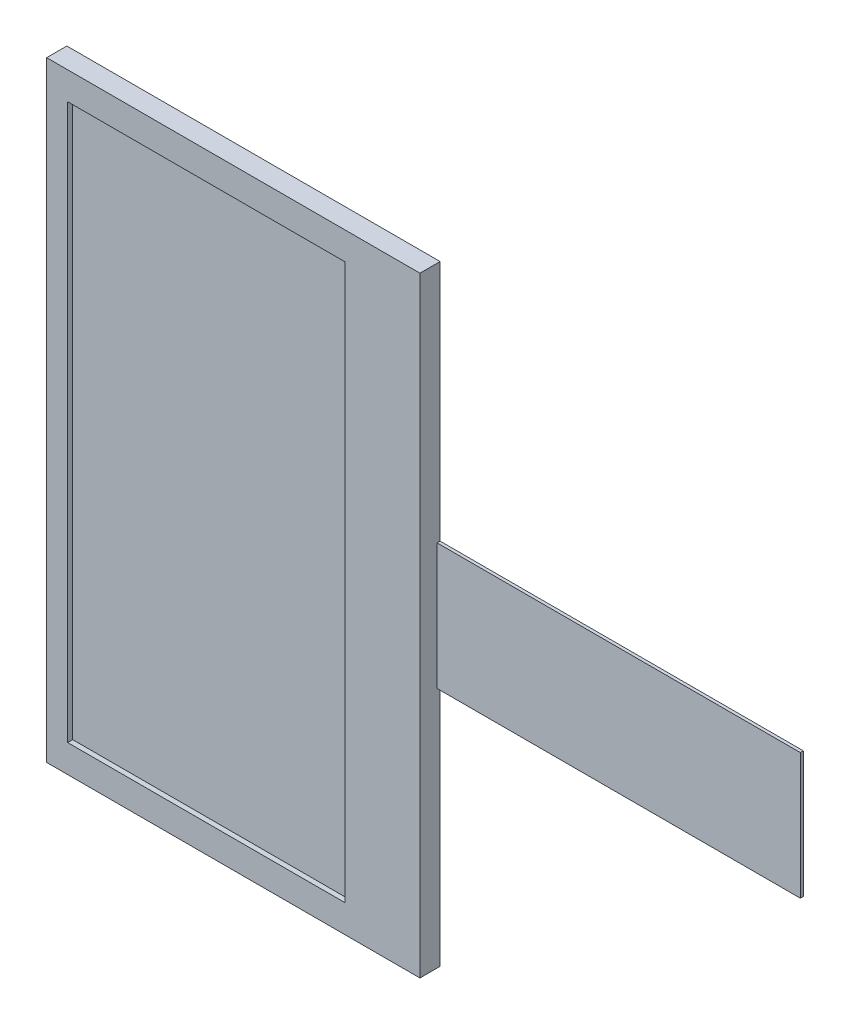
ISO-10303-21;
HEADER;
FILE_DESCRIPTION(('STEP AP214'),'2;1');
FILE_NAME('part.step','',(''),(''),'','','');
FILE_SCHEMA(('AUTOMOTIVE_DESIGN { 1 0 10303 214 1 1 1 1 }'));
ENDSEC;
DATA;
#1=APPLICATION_CONTEXT('core data for automotive mechanical design processes');
#2=APPLICATION_PROTOCOL_DEFINITION('international standard','automotive_design',2000,#1);
#3=PRODUCT_CONTEXT('',#1,'mechanical');
#4=PRODUCT('Part','Part','',(#3));
#5=PRODUCT_RELATED_PRODUCT_CATEGORY('part','',(#4));
#6=PRODUCT_DEFINITION_FORMATION('','',#4);
#7=PRODUCT_DEFINITION_CONTEXT('part definition',#1,'design');
#8=PRODUCT_DEFINITION('design','',#6,#7);
#9=PRODUCT_DEFINITION_SHAPE('','',#8);
#10=(LENGTH_UNIT() NAMED_UNIT(*) SI_UNIT(.MILLI.,.METRE.));
#11=(NAMED_UNIT(*) PLANE_ANGLE_UNIT() SI_UNIT($,.RADIAN.));
#12=(NAMED_UNIT(*) SI_UNIT($,.STERADIAN.) SOLID_ANGLE_UNIT());
#13=UNCERTAINTY_MEASURE_WITH_UNIT(LENGTH_MEASURE(1.E-05),#10,'distance_accuracy_value','');
#14=(GEOMETRIC_REPRESENTATION_CONTEXT(3) GLOBAL_UNCERTAINTY_ASSIGNED_CONTEXT((#13)) GLOBAL_UNIT_ASSIGNED_CONTEXT((#10,
#11,#12)) REPRESENTATION_CONTEXT('',''));
#15=CARTESIAN_POINT('',(0.,0.,0.));
#16=DIRECTION('',(0.,0.,1.));
#17=DIRECTION('',(1.,0.,0.));
#18=AXIS2_PLACEMENT_3D('',#15,#16,#17);
#19=CARTESIAN_POINT('',(57.175,0.,0.3));
#20=DIRECTION('',(1.,0.,0.));
#21=DIRECTION('',(0.,0.,-1.));
#22=AXIS2_PLACEMENT_3D('',#19,#20,#21);
#23=PLANE('',#22);
#24=DIRECTION('',(0.,-1.,0.));
#25=VECTOR('',#24,1.);
#26=CARTESIAN_POINT('',(57.175,0.,0.));
#27=LINE('',#26,#25);
#28=CARTESIAN_POINT('',(57.175,6.245,0.));
#29=VERTEX_POINT('',#28);
#30=CARTESIAN_POINT('',(57.175,-6.255,0.));
#31=VERTEX_POINT('',#30);
#32=EDGE_CURVE('E111',#29,#31,#27,.T.);
#33=ORIENTED_EDGE('',*,*,#32,.F.);
#34=DIRECTION('',(0.,0.,-1.));
#35=VECTOR('',#34,1.);
#36=CARTESIAN_POINT('',(57.175,6.245,0.3));
#37=LINE('',#36,#35);
#38=CARTESIAN_POINT('',(57.175,6.245,0.3));
#39=VERTEX_POINT('',#38);
#40=EDGE_CURVE('E12',#39,#29,#37,.T.);
#41=ORIENTED_EDGE('',*,*,#40,.F.);
#42=DIRECTION('',(0.,-1.,0.));
#43=VECTOR('',#42,1.);
#44=CARTESIAN_POINT('',(57.175,0.,0.3));
#45=LINE('',#44,#43);
#46=CARTESIAN_POINT('',(57.175,-6.255,0.3));
#47=VERTEX_POINT('',#46);
#48=EDGE_CURVE('E105',#39,#47,#45,.T.);
#49=ORIENTED_EDGE('',*,*,#48,.T.);
#50=DIRECTION('',(0.,0.,-1.));
#51=VECTOR('',#50,1.);
#52=CARTESIAN_POINT('',(57.175,-6.255,0.3));
#53=LINE('',#52,#51);
#54=EDGE_CURVE('E86',#47,#31,#53,.T.);
#55=ORIENTED_EDGE('',*,*,#54,.T.);
#56=EDGE_LOOP('',(#33,#41,#49,#55));
#57=FACE_BOUND('',#56,.T.);
#58=ADVANCED_FACE('F48',(#57),#23,.T.);
#59=CARTESIAN_POINT('',(0.,6.245,0.3));
#60=DIRECTION('',(0.,1.,0.));
#61=DIRECTION('',(0.,0.,1.));
#62=AXIS2_PLACEMENT_3D('',#59,#60,#61);
#63=PLANE('',#62);
#64=DIRECTION('',(1.,0.,0.));
#65=VECTOR('',#64,1.);
#66=CARTESIAN_POINT('',(0.,6.245,0.));
#67=LINE('',#66,#65);
#68=CARTESIAN_POINT('',(21.175,6.245,0.));
#69=VERTEX_POINT('',#68);
#70=EDGE_CURVE('E99',#69,#29,#67,.T.);
#71=ORIENTED_EDGE('',*,*,#70,.F.);
#72=DIRECTION('',(0.,0.,-1.));
#73=VECTOR('',#72,1.);
#74=CARTESIAN_POINT('',(21.175,6.245,0.3));
#75=LINE('',#74,#73);
#76=CARTESIAN_POINT('',(21.175,6.245,0.3));
#77=VERTEX_POINT('',#76);
#78=EDGE_CURVE('E56',#77,#69,#75,.T.);
#79=ORIENTED_EDGE('',*,*,#78,.F.);
#80=DIRECTION('',(1.,0.,0.));
#81=VECTOR('',#80,1.);
#82=CARTESIAN_POINT('',(0.,6.245,0.3));
#83=LINE('',#82,#81);
#84=EDGE_CURVE('E97',#77,#39,#83,.T.);
#85=ORIENTED_EDGE('',*,*,#84,.T.);
#86=ORIENTED_EDGE('',*,*,#40,.T.);
#87=EDGE_LOOP('',(#71,#79,#85,#86));
#88=FACE_BOUND('',#87,.T.);
#89=ADVANCED_FACE('F95',(#88),#63,.T.);
#90=CARTESIAN_POINT('',(21.175,0.,0.3));
#91=DIRECTION('',(1.,0.,0.));
#92=DIRECTION('',(0.,0.,-1.));
#93=AXIS2_PLACEMENT_3D('',#90,#91,#92);
#94=PLANE('',#93);
#95=DIRECTION('',(0.,-1.,0.));
#96=VECTOR('',#95,1.);
#97=CARTESIAN_POINT('',(21.175,0.,0.));
#98=LINE('',#97,#96);
#99=CARTESIAN_POINT('',(21.175,-6.255,0.));
#100=VERTEX_POINT('',#99);
#101=EDGE_CURVE('E79',#69,#100,#98,.T.);
#102=ORIENTED_EDGE('',*,*,#101,.T.);
#103=DIRECTION('',(0.,0.,-1.));
#104=VECTOR('',#103,1.);
#105=CARTESIAN_POINT('',(21.175,-6.255,0.3));
#106=LINE('',#105,#104);
#107=CARTESIAN_POINT('',(21.175,-6.255,0.3));
#108=VERTEX_POINT('',#107);
#109=EDGE_CURVE('E100',#108,#100,#106,.T.);
#110=ORIENTED_EDGE('',*,*,#109,.F.);
#111=DIRECTION('',(0.,-1.,0.));
#112=VECTOR('',#111,1.);
#113=CARTESIAN_POINT('',(21.175,0.,0.3));
#114=LINE('',#113,#112);
#115=EDGE_CURVE('E101',#77,#108,#114,.T.);
#116=ORIENTED_EDGE('',*,*,#115,.F.);
#117=ORIENTED_EDGE('',*,*,#78,.T.);
#118=EDGE_LOOP('',(#102,#110,#116,#117));
#119=FACE_BOUND('',#118,.T.);
#120=ADVANCED_FACE('F102',(#119),#94,.F.);
#121=CARTESIAN_POINT('',(0.,-6.255,0.3));
#122=DIRECTION('',(0.,1.,0.));
#123=DIRECTION('',(0.,0.,1.));
#124=AXIS2_PLACEMENT_3D('',#121,#122,#123);
#125=PLANE('',#124);
#126=DIRECTION('',(1.,0.,0.));
#127=VECTOR('',#126,1.);
#128=CARTESIAN_POINT('',(0.,-6.255,0.));
#129=LINE('',#128,#127);
#130=EDGE_CURVE('E107',#100,#31,#129,.T.);
#131=ORIENTED_EDGE('',*,*,#130,.T.);
#132=ORIENTED_EDGE('',*,*,#54,.F.);
#133=DIRECTION('',(1.,0.,0.));
#134=VECTOR('',#133,1.);
#135=CARTESIAN_POINT('',(0.,-6.255,0.3));
#136=LINE('',#135,#134);
#137=EDGE_CURVE('E64',#108,#47,#136,.T.);
#138=ORIENTED_EDGE('',*,*,#137,.F.);
#139=ORIENTED_EDGE('',*,*,#109,.T.);
#140=EDGE_LOOP('',(#131,#132,#138,#139));
#141=FACE_BOUND('',#140,.T.);
#142=ADVANCED_FACE('F120',(#141),#125,.F.);
#143=CARTESIAN_POINT('',(0.,0.,0.3));
#144=DIRECTION('',(0.,0.,1.));
#145=DIRECTION('',(1.,0.,0.));
#146=AXIS2_PLACEMENT_3D('',#143,#144,#145);
#147=PLANE('',#146);
#148=ORIENTED_EDGE('',*,*,#48,.F.);
#149=ORIENTED_EDGE('',*,*,#84,.F.);
#150=ORIENTED_EDGE('',*,*,#115,.T.);
#151=ORIENTED_EDGE('',*,*,#137,.T.);
#152=EDGE_LOOP('',(#148,#149,#150,#151));
#153=FACE_BOUND('',#152,.T.);
#154=ADVANCED_FACE('F104',(#153),#147,.T.);
#155=CARTESIAN_POINT('',(0.,0.,0.));
#156=DIRECTION('',(0.,0.,1.));
#157=DIRECTION('',(1.,0.,0.));
#158=AXIS2_PLACEMENT_3D('',#155,#156,#157);
#159=PLANE('',#158);
#160=ORIENTED_EDGE('',*,*,#32,.T.);
#161=ORIENTED_EDGE('',*,*,#130,.F.);
#162=ORIENTED_EDGE('',*,*,#101,.F.);
#163=ORIENTED_EDGE('',*,*,#70,.T.);
#164=EDGE_LOOP('',(#160,#161,#162,#163));
#165=FACE_BOUND('',#164,.T.);
#166=ADVANCED_FACE('F122',(#165),#159,.F.);
#167=CLOSED_SHELL('',(#58,#89,#120,#142,#154,#166));
#168=MANIFOLD_SOLID_BREP('B2',#167);
#169=CARTESIAN_POINT('',(0.,30.245,2.));
#170=DIRECTION('',(0.,-1.,0.));
#171=DIRECTION('',(0.,0.,-1.));
#172=AXIS2_PLACEMENT_3D('',#169,#170,#171);
#173=PLANE('',#172);
#174=DIRECTION('',(-1.,0.,0.));
#175=VECTOR('',#174,1.);
#176=CARTESIAN_POINT('',(0.,30.245,0.));
#177=LINE('',#176,#175);
#178=CARTESIAN_POINT('',(21.175,30.245,0.));
#179=VERTEX_POINT('',#178);
#180=CARTESIAN_POINT('',(-15.825,30.245,0.));
#181=VERTEX_POINT('',#180);
#182=EDGE_CURVE('E288',#179,#181,#177,.T.);
#183=ORIENTED_EDGE('',*,*,#182,.T.);
#184=DIRECTION('',(0.,0.,-1.));
#185=VECTOR('',#184,1.);
#186=CARTESIAN_POINT('',(-15.825,30.245,2.));
#187=LINE('',#186,#185);
#188=CARTESIAN_POINT('',(-15.825,30.245,2.));
#189=VERTEX_POINT('',#188);
#190=EDGE_CURVE('E46',#189,#181,#187,.T.);
#191=ORIENTED_EDGE('',*,*,#190,.F.);
#192=DIRECTION('',(-1.,0.,0.));
#193=VECTOR('',#192,1.);
#194=CARTESIAN_POINT('',(0.,30.245,2.));
#195=LINE('',#194,#193);
#196=CARTESIAN_POINT('',(21.175,30.245,2.));
#197=VERTEX_POINT('',#196);
#198=EDGE_CURVE('E260',#197,#189,#195,.T.);
#199=ORIENTED_EDGE('',*,*,#198,.F.);
#200=DIRECTION('',(0.,0.,-1.));
#201=VECTOR('',#200,1.);
#202=CARTESIAN_POINT('',(21.175,30.245,2.));
#203=LINE('',#202,#201);
#204=EDGE_CURVE('E200',#197,#179,#203,.T.);
#205=ORIENTED_EDGE('',*,*,#204,.T.);
#206=EDGE_LOOP('',(#183,#191,#199,#205));
#207=FACE_BOUND('',#206,.T.);
#208=ADVANCED_FACE('F181',(#207),#173,.F.);
#209=CARTESIAN_POINT('',(-15.825,0.,2.));
#210=DIRECTION('',(1.,0.,0.));
#211=DIRECTION('',(0.,0.,-1.));
#212=AXIS2_PLACEMENT_3D('',#209,#210,#211);
#213=PLANE('',#212);
#214=DIRECTION('',(0.,-1.,0.));
#215=VECTOR('',#214,1.);
#216=CARTESIAN_POINT('',(-15.825,0.,0.));
#217=LINE('',#216,#215);
#218=CARTESIAN_POINT('',(-15.825,-30.255,0.));
#219=VERTEX_POINT('',#218);
#220=EDGE_CURVE('E266',#181,#219,#217,.T.);
#221=ORIENTED_EDGE('',*,*,#220,.T.);
#222=DIRECTION('',(0.,0.,-1.));
#223=VECTOR('',#222,1.);
#224=CARTESIAN_POINT('',(-15.825,-30.255,2.));
#225=LINE('',#224,#223);
#226=CARTESIAN_POINT('',(-15.825,-30.255,2.));
#227=VERTEX_POINT('',#226);
#228=EDGE_CURVE('E191',#227,#219,#225,.T.);
#229=ORIENTED_EDGE('',*,*,#228,.F.);
#230=DIRECTION('',(0.,-1.,0.));
#231=VECTOR('',#230,1.);
#232=CARTESIAN_POINT('',(-15.825,0.,2.));
#233=LINE('',#232,#231);
#234=EDGE_CURVE('E254',#189,#227,#233,.T.);
#235=ORIENTED_EDGE('',*,*,#234,.F.);
#236=ORIENTED_EDGE('',*,*,#190,.T.);
#237=EDGE_LOOP('',(#221,#229,#235,#236));
#238=FACE_BOUND('',#237,.T.);
#239=ADVANCED_FACE('F265',(#238),#213,.F.);
#240=CARTESIAN_POINT('',(0.,-30.255,2.));
#241=DIRECTION('',(0.,-1.,0.));
#242=DIRECTION('',(0.,0.,-1.));
#243=AXIS2_PLACEMENT_3D('',#240,#241,#242);
#244=PLANE('',#243);
#245=DIRECTION('',(-1.,0.,0.));
#246=VECTOR('',#245,1.);
#247=CARTESIAN_POINT('',(0.,-30.255,0.));
#248=LINE('',#247,#246);
#249=CARTESIAN_POINT('',(21.175,-30.255,0.));
#250=VERTEX_POINT('',#249);
#251=EDGE_CURVE('E291',#250,#219,#248,.T.);
#252=ORIENTED_EDGE('',*,*,#251,.F.);
#253=DIRECTION('',(0.,0.,-1.));
#254=VECTOR('',#253,1.);
#255=CARTESIAN_POINT('',(21.175,-30.255,2.));
#256=LINE('',#255,#254);
#257=CARTESIAN_POINT('',(21.175,-30.255,2.));
#258=VERTEX_POINT('',#257);
#259=EDGE_CURVE('E226',#258,#250,#256,.T.);
#260=ORIENTED_EDGE('',*,*,#259,.F.);
#261=DIRECTION('',(-1.,0.,0.));
#262=VECTOR('',#261,1.);
#263=CARTESIAN_POINT('',(0.,-30.255,2.));
#264=LINE('',#263,#262);
#265=EDGE_CURVE('E259',#258,#227,#264,.T.);
#266=ORIENTED_EDGE('',*,*,#265,.T.);
#267=ORIENTED_EDGE('',*,*,#228,.T.);
#268=EDGE_LOOP('',(#252,#260,#266,#267));
#269=FACE_BOUND('',#268,.T.);
#270=ADVANCED_FACE('F270',(#269),#244,.T.);
#271=CARTESIAN_POINT('',(-13.745,0.,2.));
#272=DIRECTION('',(1.,0.,0.));
#273=DIRECTION('',(0.,0.,-1.));
#274=AXIS2_PLACEMENT_3D('',#271,#272,#273);
#275=PLANE('',#274);
#276=DIRECTION('',(0.,-1.,0.));
#277=VECTOR('',#276,1.);
#278=CARTESIAN_POINT('',(-13.745,0.,0.));
#279=LINE('',#278,#277);
#280=CARTESIAN_POINT('',(-13.745,27.505,0.));
#281=VERTEX_POINT('',#280);
#282=CARTESIAN_POINT('',(-13.745,-27.505,0.));
#283=VERTEX_POINT('',#282);
#284=EDGE_CURVE('E277',#281,#283,#279,.T.);
#285=ORIENTED_EDGE('',*,*,#284,.F.);
#286=DIRECTION('',(0.,0.,-1.));
#287=VECTOR('',#286,1.);
#288=CARTESIAN_POINT('',(-13.745,27.505,2.));
#289=LINE('',#288,#287);
#290=CARTESIAN_POINT('',(-13.745,27.505,2.));
#291=VERTEX_POINT('',#290);
#292=EDGE_CURVE('E185',#291,#281,#289,.T.);
#293=ORIENTED_EDGE('',*,*,#292,.F.);
#294=DIRECTION('',(0.,-1.,0.));
#295=VECTOR('',#294,1.);
#296=CARTESIAN_POINT('',(-13.745,0.,2.));
#297=LINE('',#296,#295);
#298=CARTESIAN_POINT('',(-13.745,-27.505,2.));
#299=VERTEX_POINT('',#298);
#300=EDGE_CURVE('E296',#291,#299,#297,.T.);
#301=ORIENTED_EDGE('',*,*,#300,.T.);
#302=DIRECTION('',(0.,0.,-1.));
#303=VECTOR('',#302,1.);
#304=CARTESIAN_POINT('',(-13.745,-27.505,2.));
#305=LINE('',#304,#303);
#306=EDGE_CURVE('E273',#299,#283,#305,.T.);
#307=ORIENTED_EDGE('',*,*,#306,.T.);
#308=EDGE_LOOP('',(#285,#293,#301,#307));
#309=FACE_BOUND('',#308,.T.);
#310=ADVANCED_FACE('F183',(#309),#275,.T.);
#311=CARTESIAN_POINT('',(0.,27.505,2.));
#312=DIRECTION('',(0.,-1.,0.));
#313=DIRECTION('',(0.,0.,-1.));
#314=AXIS2_PLACEMENT_3D('',#311,#312,#313);
#315=PLANE('',#314);
#316=DIRECTION('',(-1.,0.,0.));
#317=VECTOR('',#316,1.);
#318=CARTESIAN_POINT('',(0.,27.505,0.));
#319=LINE('',#318,#317);
#320=CARTESIAN_POINT('',(13.745,27.505,0.));
#321=VERTEX_POINT('',#320);
#322=EDGE_CURVE('E280',#321,#281,#319,.T.);
#323=ORIENTED_EDGE('',*,*,#322,.F.);
#324=DIRECTION('',(0.,0.,-1.));
#325=VECTOR('',#324,1.);
#326=CARTESIAN_POINT('',(13.745,27.505,2.));
#327=LINE('',#326,#325);
#328=CARTESIAN_POINT('',(13.745,27.505,2.));
#329=VERTEX_POINT('',#328);
#330=EDGE_CURVE('E302',#329,#321,#327,.T.);
#331=ORIENTED_EDGE('',*,*,#330,.F.);
#332=DIRECTION('',(-1.,0.,0.));
#333=VECTOR('',#332,1.);
#334=CARTESIAN_POINT('',(0.,27.505,2.));
#335=LINE('',#334,#333);
#336=EDGE_CURVE('E311',#329,#291,#335,.T.);
#337=ORIENTED_EDGE('',*,*,#336,.T.);
#338=ORIENTED_EDGE('',*,*,#292,.T.);
#339=EDGE_LOOP('',(#323,#331,#337,#338));
#340=FACE_BOUND('',#339,.T.);
#341=ADVANCED_FACE('F309',(#340),#315,.T.);
#342=CARTESIAN_POINT('',(13.745,0.,2.));
#343=DIRECTION('',(1.,0.,0.));
#344=DIRECTION('',(0.,0.,-1.));
#345=AXIS2_PLACEMENT_3D('',#342,#343,#344);
#346=PLANE('',#345);
#347=DIRECTION('',(0.,-1.,0.));
#348=VECTOR('',#347,1.);
#349=CARTESIAN_POINT('',(13.745,0.,0.));
#350=LINE('',#349,#348);
#351=CARTESIAN_POINT('',(13.745,-27.505,0.));
#352=VERTEX_POINT('',#351);
#353=EDGE_CURVE('E283',#321,#352,#350,.T.);
#354=ORIENTED_EDGE('',*,*,#353,.T.);
#355=DIRECTION('',(0.,0.,-1.));
#356=VECTOR('',#355,1.);
#357=CARTESIAN_POINT('',(13.745,-27.505,2.));
#358=LINE('',#357,#356);
#359=CARTESIAN_POINT('',(13.745,-27.505,2.));
#360=VERTEX_POINT('',#359);
#361=EDGE_CURVE('E300',#360,#352,#358,.T.);
#362=ORIENTED_EDGE('',*,*,#361,.F.);
#363=DIRECTION('',(0.,-1.,0.));
#364=VECTOR('',#363,1.);
#365=CARTESIAN_POINT('',(13.745,0.,2.));
#366=LINE('',#365,#364);
#367=EDGE_CURVE('E324',#329,#360,#366,.T.);
#368=ORIENTED_EDGE('',*,*,#367,.F.);
#369=ORIENTED_EDGE('',*,*,#330,.T.);
#370=EDGE_LOOP('',(#354,#362,#368,#369));
#371=FACE_BOUND('',#370,.T.);
#372=ADVANCED_FACE('F318',(#371),#346,.F.);
#373=CARTESIAN_POINT('',(0.,-27.505,2.));
#374=DIRECTION('',(0.,-1.,0.));
#375=DIRECTION('',(0.,0.,-1.));
#376=AXIS2_PLACEMENT_3D('',#373,#374,#375);
#377=PLANE('',#376);
#378=DIRECTION('',(-1.,0.,0.));
#379=VECTOR('',#378,1.);
#380=CARTESIAN_POINT('',(0.,-27.505,0.));
#381=LINE('',#380,#379);
#382=EDGE_CURVE('E285',#352,#283,#381,.T.);
#383=ORIENTED_EDGE('',*,*,#382,.T.);
#384=ORIENTED_EDGE('',*,*,#306,.F.);
#385=DIRECTION('',(-1.,0.,0.));
#386=VECTOR('',#385,1.);
#387=CARTESIAN_POINT('',(0.,-27.505,2.));
#388=LINE('',#387,#386);
#389=EDGE_CURVE('E322',#360,#299,#388,.T.);
#390=ORIENTED_EDGE('',*,*,#389,.F.);
#391=ORIENTED_EDGE('',*,*,#361,.T.);
#392=EDGE_LOOP('',(#383,#384,#390,#391));
#393=FACE_BOUND('',#392,.T.);
#394=ADVANCED_FACE('F321',(#393),#377,.F.);
#395=CARTESIAN_POINT('',(21.175,0.,2.));
#396=DIRECTION('',(1.,0.,0.));
#397=DIRECTION('',(0.,0.,-1.));
#398=AXIS2_PLACEMENT_3D('',#395,#396,#397);
#399=PLANE('',#398);
#400=DIRECTION('',(0.,-1.,0.));
#401=VECTOR('',#400,1.);
#402=CARTESIAN_POINT('',(21.175,0.,0.));
#403=LINE('',#402,#401);
#404=EDGE_CURVE('E293',#179,#250,#403,.T.);
#405=ORIENTED_EDGE('',*,*,#404,.F.);
#406=ORIENTED_EDGE('',*,*,#204,.F.);
#407=DIRECTION('',(0.,-1.,0.));
#408=VECTOR('',#407,1.);
#409=CARTESIAN_POINT('',(21.175,0.,2.));
#410=LINE('',#409,#408);
#411=EDGE_CURVE('E271',#197,#258,#410,.T.);
#412=ORIENTED_EDGE('',*,*,#411,.T.);
#413=ORIENTED_EDGE('',*,*,#259,.T.);
#414=EDGE_LOOP('',(#405,#406,#412,#413));
#415=FACE_BOUND('',#414,.T.);
#416=ADVANCED_FACE('F330',(#415),#399,.T.);
#417=CARTESIAN_POINT('',(0.,0.,2.));
#418=DIRECTION('',(0.,0.,1.));
#419=DIRECTION('',(1.,0.,0.));
#420=AXIS2_PLACEMENT_3D('',#417,#418,#419);
#421=PLANE('',#420);
#422=ORIENTED_EDGE('',*,*,#300,.F.);
#423=ORIENTED_EDGE('',*,*,#336,.F.);
#424=ORIENTED_EDGE('',*,*,#367,.T.);
#425=ORIENTED_EDGE('',*,*,#389,.T.);
#426=EDGE_LOOP('',(#422,#423,#424,#425));
#427=FACE_BOUND('',#426,.T.);
#428=ORIENTED_EDGE('',*,*,#198,.T.);
#429=ORIENTED_EDGE('',*,*,#234,.T.);
#430=ORIENTED_EDGE('',*,*,#265,.F.);
#431=ORIENTED_EDGE('',*,*,#411,.F.);
#432=EDGE_LOOP('',(#428,#429,#430,#431));
#433=FACE_BOUND('',#432,.T.);
#434=ADVANCED_FACE('F256',(#427,#433),#421,.T.);
#435=CARTESIAN_POINT('',(0.,0.,0.));
#436=DIRECTION('',(0.,0.,1.));
#437=DIRECTION('',(1.,0.,0.));
#438=AXIS2_PLACEMENT_3D('',#435,#436,#437);
#439=PLANE('',#438);
#440=ORIENTED_EDGE('',*,*,#284,.T.);
#441=ORIENTED_EDGE('',*,*,#382,.F.);
#442=ORIENTED_EDGE('',*,*,#353,.F.);
#443=ORIENTED_EDGE('',*,*,#322,.T.);
#444=EDGE_LOOP('',(#440,#441,#442,#443));
#445=FACE_BOUND('',#444,.T.);
#446=ORIENTED_EDGE('',*,*,#182,.F.);
#447=ORIENTED_EDGE('',*,*,#404,.T.);
#448=ORIENTED_EDGE('',*,*,#251,.T.);
#449=ORIENTED_EDGE('',*,*,#220,.F.);
#450=EDGE_LOOP('',(#446,#447,#448,#449));
#451=FACE_BOUND('',#450,.T.);
#452=ADVANCED_FACE('F315',(#445,#451),#439,.F.);
#453=CLOSED_SHELL('',(#208,#239,#270,#310,#341,#372,#394,#416,#434,#452));
#454=MANIFOLD_SOLID_BREP('B6',#453);
#455=CARTESIAN_POINT('',(0.,27.505,1.5));
#456=DIRECTION('',(0.,-1.,0.));
#457=DIRECTION('',(0.,0.,-1.));
#458=AXIS2_PLACEMENT_3D('',#455,#456,#457);
#459=PLANE('',#458);
#460=DIRECTION('',(-1.,0.,0.));
#461=VECTOR('',#460,1.);
#462=CARTESIAN_POINT('',(0.,27.505,0.));
#463=LINE('',#462,#461);
#464=CARTESIAN_POINT('',(13.745,27.505,0.));
#465=VERTEX_POINT('',#464);
#466=CARTESIAN_POINT('',(-13.745,27.505,0.));
#467=VERTEX_POINT('',#466);
#468=EDGE_CURVE('E474',#465,#467,#463,.T.);
#469=ORIENTED_EDGE('',*,*,#468,.T.);
#470=DIRECTION('',(0.,0.,-1.));
#471=VECTOR('',#470,1.);
#472=CARTESIAN_POINT('',(-13.745,27.505,1.5));
#473=LINE('',#472,#471);
#474=CARTESIAN_POINT('',(-13.745,27.505,1.5));
#475=VERTEX_POINT('',#474);
#476=EDGE_CURVE('E179',#475,#467,#473,.T.);
#477=ORIENTED_EDGE('',*,*,#476,.F.);
#478=DIRECTION('',(-1.,0.,0.));
#479=VECTOR('',#478,1.);
#480=CARTESIAN_POINT('',(0.,27.505,1.5));
#481=LINE('',#480,#479);
#482=CARTESIAN_POINT('',(13.745,27.505,1.5));
#483=VERTEX_POINT('',#482);
#484=EDGE_CURVE('E460',#483,#475,#481,.T.);
#485=ORIENTED_EDGE('',*,*,#484,.F.);
#486=DIRECTION('',(0.,0.,-1.));
#487=VECTOR('',#486,1.);
#488=CARTESIAN_POINT('',(13.745,27.505,1.5));
#489=LINE('',#488,#487);
#490=EDGE_CURVE('E427',#483,#465,#489,.T.);
#491=ORIENTED_EDGE('',*,*,#490,.T.);
#492=EDGE_LOOP('',(#469,#477,#485,#491));
#493=FACE_BOUND('',#492,.T.);
#494=ADVANCED_FACE('F411',(#493),#459,.F.);
#495=CARTESIAN_POINT('',(-13.745,0.,1.5));
#496=DIRECTION('',(1.,0.,0.));
#497=DIRECTION('',(0.,0.,-1.));
#498=AXIS2_PLACEMENT_3D('',#495,#496,#497);
#499=PLANE('',#498);
#500=DIRECTION('',(0.,-1.,0.));
#501=VECTOR('',#500,1.);
#502=CARTESIAN_POINT('',(-13.745,0.,0.));
#503=LINE('',#502,#501);
#504=CARTESIAN_POINT('',(-13.745,-27.505,0.));
#505=VERTEX_POINT('',#504);
#506=EDGE_CURVE('E465',#467,#505,#503,.T.);
#507=ORIENTED_EDGE('',*,*,#506,.T.);
#508=DIRECTION('',(0.,0.,-1.));
#509=VECTOR('',#508,1.);
#510=CARTESIAN_POINT('',(-13.745,-27.505,1.5));
#511=LINE('',#510,#509);
#512=CARTESIAN_POINT('',(-13.745,-27.505,1.5));
#513=VERTEX_POINT('',#512);
#514=EDGE_CURVE('E419',#513,#505,#511,.T.);
#515=ORIENTED_EDGE('',*,*,#514,.F.);
#516=DIRECTION('',(0.,-1.,0.));
#517=VECTOR('',#516,1.);
#518=CARTESIAN_POINT('',(-13.745,0.,1.5));
#519=LINE('',#518,#517);
#520=EDGE_CURVE('E452',#475,#513,#519,.T.);
#521=ORIENTED_EDGE('',*,*,#520,.F.);
#522=ORIENTED_EDGE('',*,*,#476,.T.);
#523=EDGE_LOOP('',(#507,#515,#521,#522));
#524=FACE_BOUND('',#523,.T.);
#525=ADVANCED_FACE('F464',(#524),#499,.F.);
#526=CARTESIAN_POINT('',(0.,-27.505,1.5));
#527=DIRECTION('',(0.,-1.,0.));
#528=DIRECTION('',(0.,0.,-1.));
#529=AXIS2_PLACEMENT_3D('',#526,#527,#528);
#530=PLANE('',#529);
#531=DIRECTION('',(-1.,0.,0.));
#532=VECTOR('',#531,1.);
#533=CARTESIAN_POINT('',(0.,-27.505,0.));
#534=LINE('',#533,#532);
#535=CARTESIAN_POINT('',(13.745,-27.505,0.));
#536=VERTEX_POINT('',#535);
#537=EDGE_CURVE('E477',#536,#505,#534,.T.);
#538=ORIENTED_EDGE('',*,*,#537,.F.);
#539=DIRECTION('',(0.,0.,-1.));
#540=VECTOR('',#539,1.);
#541=CARTESIAN_POINT('',(13.745,-27.505,1.5));
#542=LINE('',#541,#540);
#543=CARTESIAN_POINT('',(13.745,-27.505,1.5));
#544=VERTEX_POINT('',#543);
#545=EDGE_CURVE('E441',#544,#536,#542,.T.);
#546=ORIENTED_EDGE('',*,*,#545,.F.);
#547=DIRECTION('',(-1.,0.,0.));
#548=VECTOR('',#547,1.);
#549=CARTESIAN_POINT('',(0.,-27.505,1.5));
#550=LINE('',#549,#548);
#551=EDGE_CURVE('E459',#544,#513,#550,.T.);
#552=ORIENTED_EDGE('',*,*,#551,.T.);
#553=ORIENTED_EDGE('',*,*,#514,.T.);
#554=EDGE_LOOP('',(#538,#546,#552,#553));
#555=FACE_BOUND('',#554,.T.);
#556=ADVANCED_FACE('F468',(#555),#530,.T.);
#557=CARTESIAN_POINT('',(13.745,0.,1.5));
#558=DIRECTION('',(1.,0.,0.));
#559=DIRECTION('',(0.,0.,-1.));
#560=AXIS2_PLACEMENT_3D('',#557,#558,#559);
#561=PLANE('',#560);
#562=DIRECTION('',(0.,-1.,0.));
#563=VECTOR('',#562,1.);
#564=CARTESIAN_POINT('',(13.745,0.,0.));
#565=LINE('',#564,#563);
#566=EDGE_CURVE('E479',#465,#536,#565,.T.);
#567=ORIENTED_EDGE('',*,*,#566,.F.);
#568=ORIENTED_EDGE('',*,*,#490,.F.);
#569=DIRECTION('',(0.,-1.,0.));
#570=VECTOR('',#569,1.);
#571=CARTESIAN_POINT('',(13.745,0.,1.5));
#572=LINE('',#571,#570);
#573=EDGE_CURVE('E469',#483,#544,#572,.T.);
#574=ORIENTED_EDGE('',*,*,#573,.T.);
#575=ORIENTED_EDGE('',*,*,#545,.T.);
#576=EDGE_LOOP('',(#567,#568,#574,#575));
#577=FACE_BOUND('',#576,.T.);
#578=ADVANCED_FACE('F485',(#577),#561,.T.);
#579=CARTESIAN_POINT('',(0.,0.,1.5));
#580=DIRECTION('',(0.,0.,1.));
#581=DIRECTION('',(1.,0.,0.));
#582=AXIS2_PLACEMENT_3D('',#579,#580,#581);
#583=PLANE('',#582);
#584=ORIENTED_EDGE('',*,*,#484,.T.);
#585=ORIENTED_EDGE('',*,*,#520,.T.);
#586=ORIENTED_EDGE('',*,*,#551,.F.);
#587=ORIENTED_EDGE('',*,*,#573,.F.);
#588=EDGE_LOOP('',(#584,#585,#586,#587));
#589=FACE_BOUND('',#588,.T.);
#590=ADVANCED_FACE('F456',(#589),#583,.T.);
#591=CARTESIAN_POINT('',(0.,0.,0.));
#592=DIRECTION('',(0.,0.,1.));
#593=DIRECTION('',(1.,0.,0.));
#594=AXIS2_PLACEMENT_3D('',#591,#592,#593);
#595=PLANE('',#594);
#596=ORIENTED_EDGE('',*,*,#468,.F.);
#597=ORIENTED_EDGE('',*,*,#566,.T.);
#598=ORIENTED_EDGE('',*,*,#537,.T.);
#599=ORIENTED_EDGE('',*,*,#506,.F.);
#600=EDGE_LOOP('',(#596,#597,#598,#599));
#601=FACE_BOUND('',#600,.T.);
#602=ADVANCED_FACE('F484',(#601),#595,.F.);
#603=CLOSED_SHELL('',(#494,#525,#556,#578,#590,#602));
#604=MANIFOLD_SOLID_BREP('B40',#603);
#605=ADVANCED_BREP_SHAPE_REPRESENTATION('',(#18,#168,#454,#604),#14);
#606=SHAPE_DEFINITION_REPRESENTATION(#9,#605);
ENDSEC;
END-ISO-10303-21;
